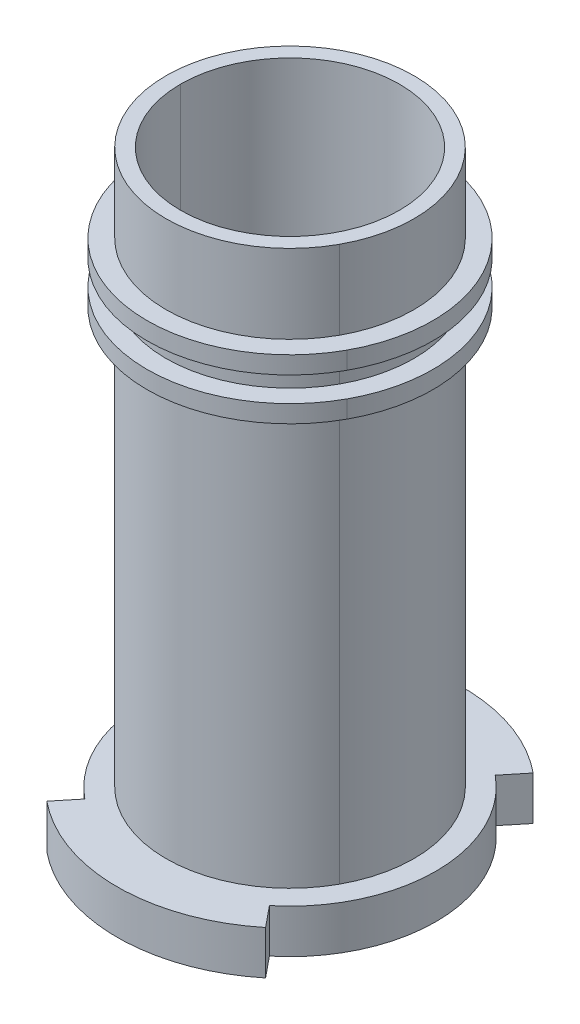
ISO-10303-21;
HEADER;
FILE_DESCRIPTION(('STEP AP214'),'2;1');
FILE_NAME('part.step','',(''),(''),'','','');
FILE_SCHEMA(('AUTOMOTIVE_DESIGN { 1 0 10303 214 1 1 1 1 }'));
ENDSEC;
DATA;
#1=APPLICATION_CONTEXT('core data for automotive mechanical design processes');
#2=APPLICATION_PROTOCOL_DEFINITION('international standard','automotive_design',2000,#1);
#3=PRODUCT_CONTEXT('',#1,'mechanical');
#4=PRODUCT('Part','Part','',(#3));
#5=PRODUCT_RELATED_PRODUCT_CATEGORY('part','',(#4));
#6=PRODUCT_DEFINITION_FORMATION('','',#4);
#7=PRODUCT_DEFINITION_CONTEXT('part definition',#1,'design');
#8=PRODUCT_DEFINITION('design','',#6,#7);
#9=PRODUCT_DEFINITION_SHAPE('','',#8);
#10=(LENGTH_UNIT() NAMED_UNIT(*) SI_UNIT(.MILLI.,.METRE.));
#11=(NAMED_UNIT(*) PLANE_ANGLE_UNIT() SI_UNIT($,.RADIAN.));
#12=(NAMED_UNIT(*) SI_UNIT($,.STERADIAN.) SOLID_ANGLE_UNIT());
#13=UNCERTAINTY_MEASURE_WITH_UNIT(LENGTH_MEASURE(1.E-05),#10,'distance_accuracy_value','');
#14=(GEOMETRIC_REPRESENTATION_CONTEXT(3) GLOBAL_UNCERTAINTY_ASSIGNED_CONTEXT((#13)) GLOBAL_UNIT_ASSIGNED_CONTEXT((#10,
#11,#12)) REPRESENTATION_CONTEXT('',''));
#15=CARTESIAN_POINT('',(0.,0.,0.));
#16=DIRECTION('',(0.,0.,1.));
#17=DIRECTION('',(1.,0.,0.));
#18=AXIS2_PLACEMENT_3D('',#15,#16,#17);
#19=CARTESIAN_POINT('',(8.5,0.,0.));
#20=DIRECTION('',(0.,-1.,0.));
#21=DIRECTION('',(0.,0.,-1.));
#22=AXIS2_PLACEMENT_3D('',#19,#20,#21);
#23=PLANE('',#22);
#24=CARTESIAN_POINT('',(0.,0.,0.));
#25=DIRECTION('',(0.,-1.,0.));
#26=DIRECTION('',(1.,0.,0.));
#27=AXIS2_PLACEMENT_3D('',#24,#25,#26);
#28=CIRCLE('',#27,7.5);
#29=CARTESIAN_POINT('',(7.5,0.,0.));
#30=VERTEX_POINT('',#29);
#31=CARTESIAN_POINT('',(-7.5,0.,0.));
#32=VERTEX_POINT('',#31);
#33=EDGE_CURVE('E295',#30,#32,#28,.T.);
#34=ORIENTED_EDGE('',*,*,#33,.F.);
#35=CARTESIAN_POINT('',(0.,0.,0.));
#36=DIRECTION('',(0.,-1.,0.));
#37=DIRECTION('',(1.,0.,0.));
#38=AXIS2_PLACEMENT_3D('',#35,#36,#37);
#39=CIRCLE('',#38,7.5);
#40=EDGE_CURVE('E11',#32,#30,#39,.T.);
#41=ORIENTED_EDGE('',*,*,#40,.F.);
#42=EDGE_LOOP('',(#34,#41));
#43=FACE_BOUND('',#42,.T.);
#44=CARTESIAN_POINT('',(0.,0.,0.));
#45=DIRECTION('',(0.,-1.,0.));
#46=DIRECTION('',(1.,0.,0.));
#47=AXIS2_PLACEMENT_3D('',#44,#45,#46);
#48=CIRCLE('',#47,8.);
#49=CARTESIAN_POINT('',(8.,0.,0.));
#50=VERTEX_POINT('',#49);
#51=CARTESIAN_POINT('',(-8.,0.,0.));
#52=VERTEX_POINT('',#51);
#53=EDGE_CURVE('E280',#50,#52,#48,.T.);
#54=ORIENTED_EDGE('',*,*,#53,.T.);
#55=CARTESIAN_POINT('',(0.,0.,0.));
#56=DIRECTION('',(0.,-1.,0.));
#57=DIRECTION('',(1.,0.,0.));
#58=AXIS2_PLACEMENT_3D('',#55,#56,#57);
#59=CIRCLE('',#58,8.);
#60=EDGE_CURVE('E299',#52,#50,#59,.T.);
#61=ORIENTED_EDGE('',*,*,#60,.T.);
#62=EDGE_LOOP('',(#54,#61));
#63=FACE_BOUND('',#62,.T.);
#64=ADVANCED_FACE('F16',(#43,#63),#23,.T.);
#65=CARTESIAN_POINT('',(0.,11.,0.));
#66=DIRECTION('',(0.,1.,0.));
#67=DIRECTION('',(-1.,0.,0.));
#68=AXIS2_PLACEMENT_3D('',#65,#66,#67);
#69=CYLINDRICAL_SURFACE('',#68,7.5);
#70=ORIENTED_EDGE('',*,*,#40,.T.);
#71=DIRECTION('',(0.,-1.,0.));
#72=VECTOR('',#71,1.);
#73=CARTESIAN_POINT('',(7.5,11.,0.));
#74=LINE('',#73,#72);
#75=CARTESIAN_POINT('',(7.5,38.,0.));
#76=VERTEX_POINT('',#75);
#77=EDGE_CURVE('E27',#76,#30,#74,.T.);
#78=ORIENTED_EDGE('',*,*,#77,.F.);
#79=CARTESIAN_POINT('',(0.,38.,0.));
#80=DIRECTION('',(0.,1.,0.));
#81=DIRECTION('',(1.,0.,0.));
#82=AXIS2_PLACEMENT_3D('',#79,#80,#81);
#83=CIRCLE('',#82,7.5);
#84=CARTESIAN_POINT('',(-7.5,38.,0.));
#85=VERTEX_POINT('',#84);
#86=EDGE_CURVE('E287',#76,#85,#83,.T.);
#87=ORIENTED_EDGE('',*,*,#86,.T.);
#88=DIRECTION('',(0.,-1.,0.));
#89=VECTOR('',#88,1.);
#90=CARTESIAN_POINT('',(-7.5,11.,0.));
#91=LINE('',#90,#89);
#92=EDGE_CURVE('E366',#85,#32,#91,.T.);
#93=ORIENTED_EDGE('',*,*,#92,.T.);
#94=EDGE_LOOP('',(#70,#78,#87,#93));
#95=FACE_BOUND('',#94,.T.);
#96=ADVANCED_FACE('F471',(#95),#69,.F.);
#97=CARTESIAN_POINT('',(0.,11.,0.));
#98=DIRECTION('',(0.,1.,0.));
#99=DIRECTION('',(-1.,0.,0.));
#100=AXIS2_PLACEMENT_3D('',#97,#98,#99);
#101=CYLINDRICAL_SURFACE('',#100,7.5);
#102=ORIENTED_EDGE('',*,*,#33,.T.);
#103=ORIENTED_EDGE('',*,*,#92,.F.);
#104=CARTESIAN_POINT('',(0.,38.,0.));
#105=DIRECTION('',(0.,1.,0.));
#106=DIRECTION('',(1.,0.,0.));
#107=AXIS2_PLACEMENT_3D('',#104,#105,#106);
#108=CIRCLE('',#107,7.5);
#109=EDGE_CURVE('E291',#85,#76,#108,.T.);
#110=ORIENTED_EDGE('',*,*,#109,.T.);
#111=ORIENTED_EDGE('',*,*,#77,.T.);
#112=EDGE_LOOP('',(#102,#103,#110,#111));
#113=FACE_BOUND('',#112,.T.);
#114=ADVANCED_FACE('F475',(#113),#101,.F.);
#115=CARTESIAN_POINT('',(0.,38.,0.));
#116=DIRECTION('',(0.,-1.,0.));
#117=DIRECTION('',(0.,0.,-1.));
#118=AXIS2_PLACEMENT_3D('',#115,#116,#117);
#119=PLANE('',#118);
#120=ORIENTED_EDGE('',*,*,#86,.F.);
#121=ORIENTED_EDGE('',*,*,#109,.F.);
#122=EDGE_LOOP('',(#120,#121));
#123=FACE_BOUND('',#122,.T.);
#124=CARTESIAN_POINT('',(0.,38.,0.));
#125=DIRECTION('',(0.,-1.,0.));
#126=DIRECTION('',(1.,0.,0.));
#127=AXIS2_PLACEMENT_3D('',#124,#125,#126);
#128=CIRCLE('',#127,8.5);
#129=CARTESIAN_POINT('',(7.45945177607,38.,4.07511707814));
#130=VERTEX_POINT('',#129);
#131=CARTESIAN_POINT('',(-7.45945177607,38.,-4.07511707814));
#132=VERTEX_POINT('',#131);
#133=EDGE_CURVE('E227',#130,#132,#128,.T.);
#134=ORIENTED_EDGE('',*,*,#133,.F.);
#135=CARTESIAN_POINT('',(0.,38.,0.));
#136=DIRECTION('',(0.,-1.,0.));
#137=DIRECTION('',(1.,0.,0.));
#138=AXIS2_PLACEMENT_3D('',#135,#136,#137);
#139=CIRCLE('',#138,8.5);
#140=EDGE_CURVE('E222',#132,#130,#139,.T.);
#141=ORIENTED_EDGE('',*,*,#140,.F.);
#142=EDGE_LOOP('',(#134,#141));
#143=FACE_BOUND('',#142,.T.);
#144=ADVANCED_FACE('F481',(#123,#143),#119,.F.);
#145=CARTESIAN_POINT('',(0.,19.,0.));
#146=DIRECTION('',(0.,-1.,0.));
#147=DIRECTION('',(0.877582561890373,0.,0.479425538604204));
#148=AXIS2_PLACEMENT_3D('',#145,#146,#147);
#149=CYLINDRICAL_SURFACE('',#148,8.5);
#150=CARTESIAN_POINT('',(0.,32.6,0.));
#151=DIRECTION('',(0.,-1.,0.));
#152=DIRECTION('',(1.,0.,0.));
#153=AXIS2_PLACEMENT_3D('',#150,#151,#152);
#154=CIRCLE('',#153,8.5);
#155=CARTESIAN_POINT('',(-7.45945177607,32.6,-4.07511707814));
#156=VERTEX_POINT('',#155);
#157=CARTESIAN_POINT('',(7.45945177607,32.6,4.07511707814));
#158=VERTEX_POINT('',#157);
#159=EDGE_CURVE('E221',#156,#158,#154,.T.);
#160=ORIENTED_EDGE('',*,*,#159,.F.);
#161=DIRECTION('',(0.,1.,0.));
#162=VECTOR('',#161,1.);
#163=CARTESIAN_POINT('',(-7.45945177607,19.,-4.07511707814));
#164=LINE('',#163,#162);
#165=EDGE_CURVE('E232',#156,#132,#164,.T.);
#166=ORIENTED_EDGE('',*,*,#165,.T.);
#167=ORIENTED_EDGE('',*,*,#140,.T.);
#168=DIRECTION('',(0.,1.,0.));
#169=VECTOR('',#168,1.);
#170=CARTESIAN_POINT('',(7.45945177607,19.,4.07511707814));
#171=LINE('',#170,#169);
#172=EDGE_CURVE('E216',#158,#130,#171,.T.);
#173=ORIENTED_EDGE('',*,*,#172,.F.);
#174=EDGE_LOOP('',(#160,#166,#167,#173));
#175=FACE_BOUND('',#174,.T.);
#176=ADVANCED_FACE('F218',(#175),#149,.T.);
#177=CARTESIAN_POINT('',(0.,19.,0.));
#178=DIRECTION('',(0.,-1.,0.));
#179=DIRECTION('',(0.877582561890373,0.,0.479425538604204));
#180=AXIS2_PLACEMENT_3D('',#177,#178,#179);
#181=CYLINDRICAL_SURFACE('',#180,8.5);
#182=CARTESIAN_POINT('',(0.,32.6,0.));
#183=DIRECTION('',(0.,-1.,0.));
#184=DIRECTION('',(1.,0.,0.));
#185=AXIS2_PLACEMENT_3D('',#182,#183,#184);
#186=CIRCLE('',#185,8.5);
#187=EDGE_CURVE('E228',#158,#156,#186,.T.);
#188=ORIENTED_EDGE('',*,*,#187,.F.);
#189=ORIENTED_EDGE('',*,*,#172,.T.);
#190=ORIENTED_EDGE('',*,*,#133,.T.);
#191=ORIENTED_EDGE('',*,*,#165,.F.);
#192=EDGE_LOOP('',(#188,#189,#190,#191));
#193=FACE_BOUND('',#192,.T.);
#194=ADVANCED_FACE('F231',(#193),#181,.T.);
#195=CARTESIAN_POINT('',(8.5,32.6,0.));
#196=DIRECTION('',(0.,-1.,0.));
#197=DIRECTION('',(0.,0.,-1.));
#198=AXIS2_PLACEMENT_3D('',#195,#196,#197);
#199=PLANE('',#198);
#200=ORIENTED_EDGE('',*,*,#159,.T.);
#201=ORIENTED_EDGE('',*,*,#187,.T.);
#202=EDGE_LOOP('',(#200,#201));
#203=FACE_BOUND('',#202,.T.);
#204=CARTESIAN_POINT('',(0.,32.6,0.));
#205=DIRECTION('',(0.,-1.,0.));
#206=DIRECTION('',(1.,0.,0.));
#207=AXIS2_PLACEMENT_3D('',#204,#205,#206);
#208=CIRCLE('',#207,9.8);
#209=CARTESIAN_POINT('',(8.60030910653,32.6,4.69837027832));
#210=VERTEX_POINT('',#209);
#211=CARTESIAN_POINT('',(-8.60030910653,32.6,-4.69837027832));
#212=VERTEX_POINT('',#211);
#213=EDGE_CURVE('E239',#210,#212,#208,.T.);
#214=ORIENTED_EDGE('',*,*,#213,.F.);
#215=CARTESIAN_POINT('',(0.,32.6,0.));
#216=DIRECTION('',(0.,-1.,0.));
#217=DIRECTION('',(1.,0.,0.));
#218=AXIS2_PLACEMENT_3D('',#215,#216,#217);
#219=CIRCLE('',#218,9.8);
#220=EDGE_CURVE('E258',#212,#210,#219,.T.);
#221=ORIENTED_EDGE('',*,*,#220,.F.);
#222=EDGE_LOOP('',(#214,#221));
#223=FACE_BOUND('',#222,.T.);
#224=ADVANCED_FACE('F236',(#203,#223),#199,.F.);
#225=CARTESIAN_POINT('',(0.,19.,0.));
#226=DIRECTION('',(0.,-1.,0.));
#227=DIRECTION('',(0.877582561890373,0.,0.479425538604204));
#228=AXIS2_PLACEMENT_3D('',#225,#226,#227);
#229=CYLINDRICAL_SURFACE('',#228,9.8);
#230=CARTESIAN_POINT('',(0.,31.4,0.));
#231=DIRECTION('',(0.,-1.,0.));
#232=DIRECTION('',(1.,0.,0.));
#233=AXIS2_PLACEMENT_3D('',#230,#231,#232);
#234=CIRCLE('',#233,9.8);
#235=CARTESIAN_POINT('',(8.60030910653,31.4,4.69837027832));
#236=VERTEX_POINT('',#235);
#237=CARTESIAN_POINT('',(-8.60030910653,31.4,-4.69837027832));
#238=VERTEX_POINT('',#237);
#239=EDGE_CURVE('E315',#236,#238,#234,.T.);
#240=ORIENTED_EDGE('',*,*,#239,.F.);
#241=DIRECTION('',(0.,1.,0.));
#242=VECTOR('',#241,1.);
#243=CARTESIAN_POINT('',(8.60030910653,30.55,4.69837027832));
#244=LINE('',#243,#242);
#245=EDGE_CURVE('E245',#236,#210,#244,.T.);
#246=ORIENTED_EDGE('',*,*,#245,.T.);
#247=ORIENTED_EDGE('',*,*,#213,.T.);
#248=DIRECTION('',(0.,1.,0.));
#249=VECTOR('',#248,1.);
#250=CARTESIAN_POINT('',(-8.60030910653,30.55,-4.69837027832));
#251=LINE('',#250,#249);
#252=EDGE_CURVE('E311',#238,#212,#251,.T.);
#253=ORIENTED_EDGE('',*,*,#252,.F.);
#254=EDGE_LOOP('',(#240,#246,#247,#253));
#255=FACE_BOUND('',#254,.T.);
#256=ADVANCED_FACE('F458',(#255),#229,.T.);
#257=CARTESIAN_POINT('',(0.,19.,0.));
#258=DIRECTION('',(0.,-1.,0.));
#259=DIRECTION('',(0.877582561890373,0.,0.479425538604204));
#260=AXIS2_PLACEMENT_3D('',#257,#258,#259);
#261=CYLINDRICAL_SURFACE('',#260,9.8);
#262=CARTESIAN_POINT('',(0.,31.4,0.));
#263=DIRECTION('',(0.,-1.,0.));
#264=DIRECTION('',(1.,0.,0.));
#265=AXIS2_PLACEMENT_3D('',#262,#263,#264);
#266=CIRCLE('',#265,9.8);
#267=EDGE_CURVE('E407',#238,#236,#266,.T.);
#268=ORIENTED_EDGE('',*,*,#267,.F.);
#269=ORIENTED_EDGE('',*,*,#252,.T.);
#270=ORIENTED_EDGE('',*,*,#220,.T.);
#271=ORIENTED_EDGE('',*,*,#245,.F.);
#272=EDGE_LOOP('',(#268,#269,#270,#271));
#273=FACE_BOUND('',#272,.T.);
#274=ADVANCED_FACE('F18',(#273),#261,.T.);
#275=CARTESIAN_POINT('',(9.8,31.4,0.));
#276=DIRECTION('',(0.,-1.,0.));
#277=DIRECTION('',(0.,0.,-1.));
#278=AXIS2_PLACEMENT_3D('',#275,#276,#277);
#279=PLANE('',#278);
#280=CARTESIAN_POINT('',(0.,31.4,0.));
#281=DIRECTION('',(0.,-1.,0.));
#282=DIRECTION('',(1.,0.,0.));
#283=AXIS2_PLACEMENT_3D('',#280,#281,#282);
#284=CIRCLE('',#283,8.5);
#285=CARTESIAN_POINT('',(7.45945177607,31.4,4.07511707814));
#286=VERTEX_POINT('',#285);
#287=CARTESIAN_POINT('',(-7.45945177607,31.4,-4.07511707814));
#288=VERTEX_POINT('',#287);
#289=EDGE_CURVE('E324',#286,#288,#284,.T.);
#290=ORIENTED_EDGE('',*,*,#289,.F.);
#291=CARTESIAN_POINT('',(0.,31.4,0.));
#292=DIRECTION('',(0.,-1.,0.));
#293=DIRECTION('',(1.,0.,0.));
#294=AXIS2_PLACEMENT_3D('',#291,#292,#293);
#295=CIRCLE('',#294,8.5);
#296=EDGE_CURVE('E323',#288,#286,#295,.T.);
#297=ORIENTED_EDGE('',*,*,#296,.F.);
#298=EDGE_LOOP('',(#290,#297));
#299=FACE_BOUND('',#298,.T.);
#300=ORIENTED_EDGE('',*,*,#267,.T.);
#301=ORIENTED_EDGE('',*,*,#239,.T.);
#302=EDGE_LOOP('',(#300,#301));
#303=FACE_BOUND('',#302,.T.);
#304=ADVANCED_FACE('F453',(#299,#303),#279,.T.);
#305=CARTESIAN_POINT('',(0.,19.,0.));
#306=DIRECTION('',(0.,-1.,0.));
#307=DIRECTION('',(0.877582561890373,0.,0.479425538604204));
#308=AXIS2_PLACEMENT_3D('',#305,#306,#307);
#309=CYLINDRICAL_SURFACE('',#308,8.5);
#310=CARTESIAN_POINT('',(0.,29.7,0.));
#311=DIRECTION('',(0.,-1.,0.));
#312=DIRECTION('',(1.,0.,0.));
#313=AXIS2_PLACEMENT_3D('',#310,#311,#312);
#314=CIRCLE('',#313,8.5);
#315=CARTESIAN_POINT('',(-7.45945177607,29.7,-4.07511707814));
#316=VERTEX_POINT('',#315);
#317=CARTESIAN_POINT('',(7.45945177607,29.7,4.07511707814));
#318=VERTEX_POINT('',#317);
#319=EDGE_CURVE('E281',#316,#318,#314,.T.);
#320=ORIENTED_EDGE('',*,*,#319,.F.);
#321=DIRECTION('',(0.,1.,0.));
#322=VECTOR('',#321,1.);
#323=CARTESIAN_POINT('',(-7.45945177607,19.,-4.07511707814));
#324=LINE('',#323,#322);
#325=EDGE_CURVE('E319',#316,#288,#324,.T.);
#326=ORIENTED_EDGE('',*,*,#325,.T.);
#327=ORIENTED_EDGE('',*,*,#296,.T.);
#328=DIRECTION('',(0.,1.,0.));
#329=VECTOR('',#328,1.);
#330=CARTESIAN_POINT('',(7.45945177607,19.,4.07511707814));
#331=LINE('',#330,#329);
#332=EDGE_CURVE('E337',#318,#286,#331,.T.);
#333=ORIENTED_EDGE('',*,*,#332,.F.);
#334=EDGE_LOOP('',(#320,#326,#327,#333));
#335=FACE_BOUND('',#334,.T.);
#336=ADVANCED_FACE('F548',(#335),#309,.T.);
#337=CARTESIAN_POINT('',(0.,19.,0.));
#338=DIRECTION('',(0.,-1.,0.));
#339=DIRECTION('',(0.877582561890373,0.,0.479425538604204));
#340=AXIS2_PLACEMENT_3D('',#337,#338,#339);
#341=CYLINDRICAL_SURFACE('',#340,8.5);
#342=CARTESIAN_POINT('',(0.,29.7,0.));
#343=DIRECTION('',(0.,-1.,0.));
#344=DIRECTION('',(1.,0.,0.));
#345=AXIS2_PLACEMENT_3D('',#342,#343,#344);
#346=CIRCLE('',#345,8.5);
#347=EDGE_CURVE('E285',#318,#316,#346,.T.);
#348=ORIENTED_EDGE('',*,*,#347,.F.);
#349=ORIENTED_EDGE('',*,*,#332,.T.);
#350=ORIENTED_EDGE('',*,*,#289,.T.);
#351=ORIENTED_EDGE('',*,*,#325,.F.);
#352=EDGE_LOOP('',(#348,#349,#350,#351));
#353=FACE_BOUND('',#352,.T.);
#354=ADVANCED_FACE('F550',(#353),#341,.T.);
#355=CARTESIAN_POINT('',(8.5,29.7,0.));
#356=DIRECTION('',(0.,-1.,0.));
#357=DIRECTION('',(0.,0.,-1.));
#358=AXIS2_PLACEMENT_3D('',#355,#356,#357);
#359=PLANE('',#358);
#360=ORIENTED_EDGE('',*,*,#319,.T.);
#361=ORIENTED_EDGE('',*,*,#347,.T.);
#362=EDGE_LOOP('',(#360,#361));
#363=FACE_BOUND('',#362,.T.);
#364=CARTESIAN_POINT('',(0.,29.7,0.));
#365=DIRECTION('',(0.,-1.,0.));
#366=DIRECTION('',(1.,0.,0.));
#367=AXIS2_PLACEMENT_3D('',#364,#365,#366);
#368=CIRCLE('',#367,9.8);
#369=CARTESIAN_POINT('',(8.60030910653,29.7,4.69837027832));
#370=VERTEX_POINT('',#369);
#371=CARTESIAN_POINT('',(-8.60030910653,29.7,-4.69837027832));
#372=VERTEX_POINT('',#371);
#373=EDGE_CURVE('E286',#370,#372,#368,.T.);
#374=ORIENTED_EDGE('',*,*,#373,.F.);
#375=CARTESIAN_POINT('',(0.,29.7,0.));
#376=DIRECTION('',(0.,-1.,0.));
#377=DIRECTION('',(1.,0.,0.));
#378=AXIS2_PLACEMENT_3D('',#375,#376,#377);
#379=CIRCLE('',#378,9.8);
#380=EDGE_CURVE('E400',#372,#370,#379,.T.);
#381=ORIENTED_EDGE('',*,*,#380,.F.);
#382=EDGE_LOOP('',(#374,#381));
#383=FACE_BOUND('',#382,.T.);
#384=ADVANCED_FACE('F540',(#363,#383),#359,.F.);
#385=CARTESIAN_POINT('',(0.,19.,0.));
#386=DIRECTION('',(0.,-1.,0.));
#387=DIRECTION('',(0.877582561890373,0.,0.479425538604204));
#388=AXIS2_PLACEMENT_3D('',#385,#386,#387);
#389=CYLINDRICAL_SURFACE('',#388,9.8);
#390=CARTESIAN_POINT('',(0.,28.5,0.));
#391=DIRECTION('',(0.,-1.,0.));
#392=DIRECTION('',(1.,0.,0.));
#393=AXIS2_PLACEMENT_3D('',#390,#391,#392);
#394=CIRCLE('',#393,9.8);
#395=CARTESIAN_POINT('',(8.60030910653,28.5,4.69837027832));
#396=VERTEX_POINT('',#395);
#397=CARTESIAN_POINT('',(-8.60030910653,28.5,-4.69837027832));
#398=VERTEX_POINT('',#397);
#399=EDGE_CURVE('E328',#396,#398,#394,.T.);
#400=ORIENTED_EDGE('',*,*,#399,.F.);
#401=DIRECTION('',(0.,1.,0.));
#402=VECTOR('',#401,1.);
#403=CARTESIAN_POINT('',(8.60030910653,30.55,4.69837027832));
#404=LINE('',#403,#402);
#405=EDGE_CURVE('E303',#396,#370,#404,.T.);
#406=ORIENTED_EDGE('',*,*,#405,.T.);
#407=ORIENTED_EDGE('',*,*,#373,.T.);
#408=DIRECTION('',(0.,1.,0.));
#409=VECTOR('',#408,1.);
#410=CARTESIAN_POINT('',(-8.60030910653,30.55,-4.69837027832));
#411=LINE('',#410,#409);
#412=EDGE_CURVE('E332',#398,#372,#411,.T.);
#413=ORIENTED_EDGE('',*,*,#412,.F.);
#414=EDGE_LOOP('',(#400,#406,#407,#413));
#415=FACE_BOUND('',#414,.T.);
#416=ADVANCED_FACE('F537',(#415),#389,.T.);
#417=CARTESIAN_POINT('',(0.,19.,0.));
#418=DIRECTION('',(0.,-1.,0.));
#419=DIRECTION('',(0.877582561890373,0.,0.479425538604204));
#420=AXIS2_PLACEMENT_3D('',#417,#418,#419);
#421=CYLINDRICAL_SURFACE('',#420,9.8);
#422=CARTESIAN_POINT('',(0.,28.5,0.));
#423=DIRECTION('',(0.,-1.,0.));
#424=DIRECTION('',(1.,0.,0.));
#425=AXIS2_PLACEMENT_3D('',#422,#423,#424);
#426=CIRCLE('',#425,9.8);
#427=EDGE_CURVE('E333',#398,#396,#426,.T.);
#428=ORIENTED_EDGE('',*,*,#427,.F.);
#429=ORIENTED_EDGE('',*,*,#412,.T.);
#430=ORIENTED_EDGE('',*,*,#380,.T.);
#431=ORIENTED_EDGE('',*,*,#405,.F.);
#432=EDGE_LOOP('',(#428,#429,#430,#431));
#433=FACE_BOUND('',#432,.T.);
#434=ADVANCED_FACE('F497',(#433),#421,.T.);
#435=CARTESIAN_POINT('',(9.8,28.5,0.));
#436=DIRECTION('',(0.,-1.,0.));
#437=DIRECTION('',(0.,0.,-1.));
#438=AXIS2_PLACEMENT_3D('',#435,#436,#437);
#439=PLANE('',#438);
#440=CARTESIAN_POINT('',(0.,28.5,0.));
#441=DIRECTION('',(0.,-1.,0.));
#442=DIRECTION('',(1.,0.,0.));
#443=AXIS2_PLACEMENT_3D('',#440,#441,#442);
#444=CIRCLE('',#443,8.5);
#445=CARTESIAN_POINT('',(7.45945177607,28.5,4.07511707814));
#446=VERTEX_POINT('',#445);
#447=CARTESIAN_POINT('',(-7.45945177607,28.5,-4.07511707814));
#448=VERTEX_POINT('',#447);
#449=EDGE_CURVE('E249',#446,#448,#444,.T.);
#450=ORIENTED_EDGE('',*,*,#449,.F.);
#451=CARTESIAN_POINT('',(0.,28.5,0.));
#452=DIRECTION('',(0.,-1.,0.));
#453=DIRECTION('',(1.,0.,0.));
#454=AXIS2_PLACEMENT_3D('',#451,#452,#453);
#455=CIRCLE('',#454,8.5);
#456=EDGE_CURVE('E264',#448,#446,#455,.T.);
#457=ORIENTED_EDGE('',*,*,#456,.F.);
#458=EDGE_LOOP('',(#450,#457));
#459=FACE_BOUND('',#458,.T.);
#460=ORIENTED_EDGE('',*,*,#427,.T.);
#461=ORIENTED_EDGE('',*,*,#399,.T.);
#462=EDGE_LOOP('',(#460,#461));
#463=FACE_BOUND('',#462,.T.);
#464=ADVANCED_FACE('F494',(#459,#463),#439,.T.);
#465=CARTESIAN_POINT('',(0.,19.,0.));
#466=DIRECTION('',(0.,-1.,0.));
#467=DIRECTION('',(0.877582561890373,0.,0.479425538604204));
#468=AXIS2_PLACEMENT_3D('',#465,#466,#467);
#469=CYLINDRICAL_SURFACE('',#468,8.5);
#470=CARTESIAN_POINT('',(0.,0.,0.));
#471=DIRECTION('',(0.,-1.,0.));
#472=DIRECTION('',(1.,0.,0.));
#473=AXIS2_PLACEMENT_3D('',#470,#471,#472);
#474=CIRCLE('',#473,8.5);
#475=CARTESIAN_POINT('',(-7.45945177607,0.,-4.07511707814));
#476=VERTEX_POINT('',#475);
#477=CARTESIAN_POINT('',(7.45945177607,0.,4.07511707814));
#478=VERTEX_POINT('',#477);
#479=EDGE_CURVE('E356',#476,#478,#474,.T.);
#480=ORIENTED_EDGE('',*,*,#479,.F.);
#481=DIRECTION('',(0.,1.,0.));
#482=VECTOR('',#481,1.);
#483=CARTESIAN_POINT('',(-7.45945177607,19.,-4.07511707814));
#484=LINE('',#483,#482);
#485=EDGE_CURVE('E260',#476,#448,#484,.T.);
#486=ORIENTED_EDGE('',*,*,#485,.T.);
#487=ORIENTED_EDGE('',*,*,#456,.T.);
#488=DIRECTION('',(0.,1.,0.));
#489=VECTOR('',#488,1.);
#490=CARTESIAN_POINT('',(7.45945177607,19.,4.07511707814));
#491=LINE('',#490,#489);
#492=EDGE_CURVE('E276',#478,#446,#491,.T.);
#493=ORIENTED_EDGE('',*,*,#492,.F.);
#494=EDGE_LOOP('',(#480,#486,#487,#493));
#495=FACE_BOUND('',#494,.T.);
#496=ADVANCED_FACE('F492',(#495),#469,.T.);
#497=CARTESIAN_POINT('',(0.,19.,0.));
#498=DIRECTION('',(0.,-1.,0.));
#499=DIRECTION('',(0.877582561890373,0.,0.479425538604204));
#500=AXIS2_PLACEMENT_3D('',#497,#498,#499);
#501=CYLINDRICAL_SURFACE('',#500,8.5);
#502=CARTESIAN_POINT('',(0.,0.,0.));
#503=DIRECTION('',(0.,-1.,0.));
#504=DIRECTION('',(1.,0.,0.));
#505=AXIS2_PLACEMENT_3D('',#502,#503,#504);
#506=CIRCLE('',#505,8.5);
#507=EDGE_CURVE('E360',#478,#476,#506,.T.);
#508=ORIENTED_EDGE('',*,*,#507,.F.);
#509=ORIENTED_EDGE('',*,*,#492,.T.);
#510=ORIENTED_EDGE('',*,*,#449,.T.);
#511=ORIENTED_EDGE('',*,*,#485,.F.);
#512=EDGE_LOOP('',(#508,#509,#510,#511));
#513=FACE_BOUND('',#512,.T.);
#514=ADVANCED_FACE('F488',(#513),#501,.T.);
#515=CARTESIAN_POINT('',(0.,-1.5,0.));
#516=DIRECTION('',(0.,-1.,0.));
#517=DIRECTION('',(1.,0.,0.));
#518=AXIS2_PLACEMENT_3D('',#515,#516,#517);
#519=CYLINDRICAL_SURFACE('',#518,8.);
#520=CARTESIAN_POINT('',(0.,-3.,0.));
#521=DIRECTION('',(0.,-1.,0.));
#522=DIRECTION('',(1.,0.,0.));
#523=AXIS2_PLACEMENT_3D('',#520,#521,#522);
#524=CIRCLE('',#523,8.);
#525=CARTESIAN_POINT('',(8.,-3.,0.));
#526=VERTEX_POINT('',#525);
#527=CARTESIAN_POINT('',(-8.,-3.,0.));
#528=VERTEX_POINT('',#527);
#529=EDGE_CURVE('E251',#526,#528,#524,.T.);
#530=ORIENTED_EDGE('',*,*,#529,.T.);
#531=DIRECTION('',(0.,-1.,0.));
#532=VECTOR('',#531,1.);
#533=CARTESIAN_POINT('',(-8.,-1.5,0.));
#534=LINE('',#533,#532);
#535=EDGE_CURVE('E296',#52,#528,#534,.T.);
#536=ORIENTED_EDGE('',*,*,#535,.F.);
#537=ORIENTED_EDGE('',*,*,#53,.F.);
#538=DIRECTION('',(0.,-1.,0.));
#539=VECTOR('',#538,1.);
#540=CARTESIAN_POINT('',(8.,-1.5,0.));
#541=LINE('',#540,#539);
#542=EDGE_CURVE('E346',#50,#526,#541,.T.);
#543=ORIENTED_EDGE('',*,*,#542,.T.);
#544=EDGE_LOOP('',(#530,#536,#537,#543));
#545=FACE_BOUND('',#544,.T.);
#546=ADVANCED_FACE('F491',(#545),#519,.F.);
#547=CARTESIAN_POINT('',(0.,-1.5,0.));
#548=DIRECTION('',(0.,-1.,0.));
#549=DIRECTION('',(1.,0.,0.));
#550=AXIS2_PLACEMENT_3D('',#547,#548,#549);
#551=CYLINDRICAL_SURFACE('',#550,8.);
#552=CARTESIAN_POINT('',(0.,-3.,0.));
#553=DIRECTION('',(0.,-1.,0.));
#554=DIRECTION('',(1.,0.,0.));
#555=AXIS2_PLACEMENT_3D('',#552,#553,#554);
#556=CIRCLE('',#555,8.);
#557=EDGE_CURVE('E255',#528,#526,#556,.T.);
#558=ORIENTED_EDGE('',*,*,#557,.T.);
#559=ORIENTED_EDGE('',*,*,#542,.F.);
#560=ORIENTED_EDGE('',*,*,#60,.F.);
#561=ORIENTED_EDGE('',*,*,#535,.T.);
#562=EDGE_LOOP('',(#558,#559,#560,#561));
#563=FACE_BOUND('',#562,.T.);
#564=ADVANCED_FACE('F501',(#563),#551,.F.);
#565=CARTESIAN_POINT('',(-6.32911392405,0.,-7.74224237133));
#566=DIRECTION('',(-0.774224237132918,0.,0.632911392404933));
#567=DIRECTION('',(0.,1.,0.));
#568=AXIS2_PLACEMENT_3D('',#565,#566,#567);
#569=PLANE('',#568);
#570=DIRECTION('',(0.,-1.,0.));
#571=VECTOR('',#570,1.);
#572=CARTESIAN_POINT('',(6.32911392405,-1.5,7.74224237133));
#573=LINE('',#572,#571);
#574=CARTESIAN_POINT('',(6.32911392405,0.,7.74224237133));
#575=VERTEX_POINT('',#574);
#576=CARTESIAN_POINT('',(6.32911392405,-3.,7.74224237133));
#577=VERTEX_POINT('',#576);
#578=EDGE_CURVE('E349',#575,#577,#573,.T.);
#579=ORIENTED_EDGE('',*,*,#578,.F.);
#580=DIRECTION('',(0.632911392404933,0.,0.774224237132918));
#581=VECTOR('',#580,1.);
#582=CARTESIAN_POINT('',(6.91455696203,0.,8.45839979068));
#583=LINE('',#582,#581);
#584=CARTESIAN_POINT('',(7.5,0.,9.17455721002));
#585=VERTEX_POINT('',#584);
#586=EDGE_CURVE('E381',#575,#585,#583,.T.);
#587=ORIENTED_EDGE('',*,*,#586,.T.);
#588=DIRECTION('',(0.,-1.,0.));
#589=VECTOR('',#588,1.);
#590=CARTESIAN_POINT('',(7.5,-1.5,9.17455721002));
#591=LINE('',#590,#589);
#592=CARTESIAN_POINT('',(7.5,-3.,9.17455721002));
#593=VERTEX_POINT('',#592);
#594=EDGE_CURVE('E254',#585,#593,#591,.T.);
#595=ORIENTED_EDGE('',*,*,#594,.T.);
#596=DIRECTION('',(0.632911392404933,0.,0.774224237132918));
#597=VECTOR('',#596,1.);
#598=CARTESIAN_POINT('',(6.91455696203,-3.,8.45839979068));
#599=LINE('',#598,#597);
#600=EDGE_CURVE('E270',#577,#593,#599,.T.);
#601=ORIENTED_EDGE('',*,*,#600,.F.);
#602=EDGE_LOOP('',(#579,#587,#595,#601));
#603=FACE_BOUND('',#602,.T.);
#604=ADVANCED_FACE('F487',(#603),#569,.F.);
#605=CARTESIAN_POINT('',(0.,-1.5,0.));
#606=DIRECTION('',(0.,-1.,0.));
#607=DIRECTION('',(0.632911392404933,0.,-0.774224237132918));
#608=AXIS2_PLACEMENT_3D('',#605,#606,#607);
#609=CYLINDRICAL_SURFACE('',#608,10.);
#610=DIRECTION('',(0.,-1.,0.));
#611=VECTOR('',#610,1.);
#612=CARTESIAN_POINT('',(6.32911392405,-1.5,-7.74224237133));
#613=LINE('',#612,#611);
#614=CARTESIAN_POINT('',(6.32911392405,0.,-7.74224237133));
#615=VERTEX_POINT('',#614);
#616=CARTESIAN_POINT('',(6.32911392405,-3.,-7.74224237133));
#617=VERTEX_POINT('',#616);
#618=EDGE_CURVE('E327',#615,#617,#613,.T.);
#619=ORIENTED_EDGE('',*,*,#618,.F.);
#620=CARTESIAN_POINT('',(0.,0.,0.));
#621=DIRECTION('',(0.,-1.,0.));
#622=DIRECTION('',(1.,0.,0.));
#623=AXIS2_PLACEMENT_3D('',#620,#621,#622);
#624=CIRCLE('',#623,10.);
#625=EDGE_CURVE('E371',#615,#575,#624,.T.);
#626=ORIENTED_EDGE('',*,*,#625,.T.);
#627=ORIENTED_EDGE('',*,*,#578,.T.);
#628=CARTESIAN_POINT('',(0.,-3.,0.));
#629=DIRECTION('',(0.,-1.,0.));
#630=DIRECTION('',(1.,0.,0.));
#631=AXIS2_PLACEMENT_3D('',#628,#629,#630);
#632=CIRCLE('',#631,10.);
#633=EDGE_CURVE('E275',#617,#577,#632,.T.);
#634=ORIENTED_EDGE('',*,*,#633,.F.);
#635=EDGE_LOOP('',(#619,#626,#627,#634));
#636=FACE_BOUND('',#635,.T.);
#637=ADVANCED_FACE('F483',(#636),#609,.T.);
#638=CARTESIAN_POINT('',(6.32911392405,0.,-7.74224237133));
#639=DIRECTION('',(-0.774224237132918,0.,-0.632911392404933));
#640=DIRECTION('',(-0.632911392404933,0.,0.774224237132918));
#641=AXIS2_PLACEMENT_3D('',#638,#639,#640);
#642=PLANE('',#641);
#643=DIRECTION('',(0.,-1.,0.));
#644=VECTOR('',#643,1.);
#645=CARTESIAN_POINT('',(7.5,-1.5,-9.17455721002));
#646=LINE('',#645,#644);
#647=CARTESIAN_POINT('',(7.5,0.,-9.17455721002));
#648=VERTEX_POINT('',#647);
#649=CARTESIAN_POINT('',(7.5,-3.,-9.17455721002));
#650=VERTEX_POINT('',#649);
#651=EDGE_CURVE('E79',#648,#650,#646,.T.);
#652=ORIENTED_EDGE('',*,*,#651,.F.);
#653=DIRECTION('',(-0.632911392404933,0.,0.774224237132918));
#654=VECTOR('',#653,1.);
#655=CARTESIAN_POINT('',(6.91455696203,0.,-8.45839979068));
#656=LINE('',#655,#654);
#657=EDGE_CURVE('E367',#648,#615,#656,.T.);
#658=ORIENTED_EDGE('',*,*,#657,.T.);
#659=ORIENTED_EDGE('',*,*,#618,.T.);
#660=DIRECTION('',(-0.632911392404933,0.,0.774224237132918));
#661=VECTOR('',#660,1.);
#662=CARTESIAN_POINT('',(6.91455696203,-3.,-8.45839979068));
#663=LINE('',#662,#661);
#664=EDGE_CURVE('E354',#650,#617,#663,.T.);
#665=ORIENTED_EDGE('',*,*,#664,.F.);
#666=EDGE_LOOP('',(#652,#658,#659,#665));
#667=FACE_BOUND('',#666,.T.);
#668=ADVANCED_FACE('F486',(#667),#642,.F.);
#669=CARTESIAN_POINT('',(0.,-1.5,0.));
#670=DIRECTION('',(0.,-1.,0.));
#671=DIRECTION('',(-0.632911392404933,0.,-0.774224237132918));
#672=AXIS2_PLACEMENT_3D('',#669,#670,#671);
#673=CYLINDRICAL_SURFACE('',#672,11.85);
#674=DIRECTION('',(0.,-1.,0.));
#675=VECTOR('',#674,1.);
#676=CARTESIAN_POINT('',(-7.5,-1.5,-9.17455721002));
#677=LINE('',#676,#675);
#678=CARTESIAN_POINT('',(-7.5,0.,-9.17455721002));
#679=VERTEX_POINT('',#678);
#680=CARTESIAN_POINT('',(-7.5,-3.,-9.17455721002));
#681=VERTEX_POINT('',#680);
#682=EDGE_CURVE('E422',#679,#681,#677,.T.);
#683=ORIENTED_EDGE('',*,*,#682,.F.);
#684=CARTESIAN_POINT('',(0.,0.,0.));
#685=DIRECTION('',(0.,-1.,0.));
#686=DIRECTION('',(1.,0.,0.));
#687=AXIS2_PLACEMENT_3D('',#684,#685,#686);
#688=CIRCLE('',#687,11.85);
#689=EDGE_CURVE('E370',#679,#648,#688,.T.);
#690=ORIENTED_EDGE('',*,*,#689,.T.);
#691=ORIENTED_EDGE('',*,*,#651,.T.);
#692=CARTESIAN_POINT('',(0.,-3.,0.));
#693=DIRECTION('',(0.,-1.,0.));
#694=DIRECTION('',(1.,0.,0.));
#695=AXIS2_PLACEMENT_3D('',#692,#693,#694);
#696=CIRCLE('',#695,11.85);
#697=EDGE_CURVE('E88',#681,#650,#696,.T.);
#698=ORIENTED_EDGE('',*,*,#697,.F.);
#699=EDGE_LOOP('',(#683,#690,#691,#698));
#700=FACE_BOUND('',#699,.T.);
#701=ADVANCED_FACE('F518',(#700),#673,.T.);
#702=CARTESIAN_POINT('',(0.,-1.5,0.));
#703=DIRECTION('',(0.,-1.,0.));
#704=DIRECTION('',(0.632911392404933,0.,0.774224237132918));
#705=AXIS2_PLACEMENT_3D('',#702,#703,#704);
#706=CYLINDRICAL_SURFACE('',#705,11.85);
#707=ORIENTED_EDGE('',*,*,#594,.F.);
#708=CARTESIAN_POINT('',(0.,0.,0.));
#709=DIRECTION('',(0.,-1.,0.));
#710=DIRECTION('',(1.,0.,0.));
#711=AXIS2_PLACEMENT_3D('',#708,#709,#710);
#712=CIRCLE('',#711,11.85);
#713=CARTESIAN_POINT('',(-7.5,0.,9.17455721002));
#714=VERTEX_POINT('',#713);
#715=EDGE_CURVE('E390',#585,#714,#712,.T.);
#716=ORIENTED_EDGE('',*,*,#715,.T.);
#717=DIRECTION('',(0.,-1.,0.));
#718=VECTOR('',#717,1.);
#719=CARTESIAN_POINT('',(-7.5,-1.5,9.17455721002));
#720=LINE('',#719,#718);
#721=CARTESIAN_POINT('',(-7.5,-3.,9.17455721002));
#722=VERTEX_POINT('',#721);
#723=EDGE_CURVE('E265',#714,#722,#720,.T.);
#724=ORIENTED_EDGE('',*,*,#723,.T.);
#725=CARTESIAN_POINT('',(0.,-3.,0.));
#726=DIRECTION('',(0.,-1.,0.));
#727=DIRECTION('',(1.,0.,0.));
#728=AXIS2_PLACEMENT_3D('',#725,#726,#727);
#729=CIRCLE('',#728,11.85);
#730=EDGE_CURVE('E274',#593,#722,#729,.T.);
#731=ORIENTED_EDGE('',*,*,#730,.F.);
#732=EDGE_LOOP('',(#707,#716,#724,#731));
#733=FACE_BOUND('',#732,.T.);
#734=ADVANCED_FACE('F516',(#733),#706,.T.);
#735=CARTESIAN_POINT('',(0.,-3.,0.));
#736=DIRECTION('',(0.,-1.,0.));
#737=DIRECTION('',(0.,0.,-1.));
#738=AXIS2_PLACEMENT_3D('',#735,#736,#737);
#739=PLANE('',#738);
#740=ORIENTED_EDGE('',*,*,#557,.F.);
#741=ORIENTED_EDGE('',*,*,#529,.F.);
#742=EDGE_LOOP('',(#740,#741));
#743=FACE_BOUND('',#742,.T.);
#744=CARTESIAN_POINT('',(0.,-3.,0.));
#745=DIRECTION('',(0.,-1.,0.));
#746=DIRECTION('',(1.,0.,0.));
#747=AXIS2_PLACEMENT_3D('',#744,#745,#746);
#748=CIRCLE('',#747,10.);
#749=CARTESIAN_POINT('',(-6.32911392405,-3.,7.74224237133));
#750=VERTEX_POINT('',#749);
#751=CARTESIAN_POINT('',(-6.32911392405,-3.,-7.74224237133));
#752=VERTEX_POINT('',#751);
#753=EDGE_CURVE('E269',#750,#752,#748,.T.);
#754=ORIENTED_EDGE('',*,*,#753,.T.);
#755=DIRECTION('',(-0.632911392404933,0.,-0.774224237132918));
#756=VECTOR('',#755,1.);
#757=CARTESIAN_POINT('',(-6.91455696203,-3.,-8.45839979068));
#758=LINE('',#757,#756);
#759=EDGE_CURVE('E355',#752,#681,#758,.T.);
#760=ORIENTED_EDGE('',*,*,#759,.T.);
#761=ORIENTED_EDGE('',*,*,#697,.T.);
#762=ORIENTED_EDGE('',*,*,#664,.T.);
#763=ORIENTED_EDGE('',*,*,#633,.T.);
#764=ORIENTED_EDGE('',*,*,#600,.T.);
#765=ORIENTED_EDGE('',*,*,#730,.T.);
#766=DIRECTION('',(0.632911392404933,0.,-0.774224237132918));
#767=VECTOR('',#766,1.);
#768=CARTESIAN_POINT('',(-6.91455696203,-3.,8.45839979068));
#769=LINE('',#768,#767);
#770=EDGE_CURVE('E433',#722,#750,#769,.T.);
#771=ORIENTED_EDGE('',*,*,#770,.T.);
#772=EDGE_LOOP('',(#754,#760,#761,#762,#763,#764,#765,#771));
#773=FACE_BOUND('',#772,.T.);
#774=ADVANCED_FACE('F512',(#743,#773),#739,.T.);
#775=CARTESIAN_POINT('',(-6.32911392405,0.,-7.74224237133));
#776=DIRECTION('',(-0.774224237132918,0.,0.632911392404933));
#777=DIRECTION('',(0.,1.,0.));
#778=AXIS2_PLACEMENT_3D('',#775,#776,#777);
#779=PLANE('',#778);
#780=DIRECTION('',(0.,-1.,0.));
#781=VECTOR('',#780,1.);
#782=CARTESIAN_POINT('',(-6.32911392405,-1.5,-7.74224237133));
#783=LINE('',#782,#781);
#784=CARTESIAN_POINT('',(-6.32911392405,0.,-7.74224237133));
#785=VERTEX_POINT('',#784);
#786=EDGE_CURVE('E338',#785,#752,#783,.T.);
#787=ORIENTED_EDGE('',*,*,#786,.F.);
#788=DIRECTION('',(-0.632911392404933,0.,-0.774224237132918));
#789=VECTOR('',#788,1.);
#790=CARTESIAN_POINT('',(-6.91455696203,0.,-8.45839979068));
#791=LINE('',#790,#789);
#792=EDGE_CURVE('E361',#785,#679,#791,.T.);
#793=ORIENTED_EDGE('',*,*,#792,.T.);
#794=ORIENTED_EDGE('',*,*,#682,.T.);
#795=ORIENTED_EDGE('',*,*,#759,.F.);
#796=EDGE_LOOP('',(#787,#793,#794,#795));
#797=FACE_BOUND('',#796,.T.);
#798=ADVANCED_FACE('F515',(#797),#779,.T.);
#799=CARTESIAN_POINT('',(8.5,0.,0.));
#800=DIRECTION('',(0.,-1.,0.));
#801=DIRECTION('',(0.,0.,-1.));
#802=AXIS2_PLACEMENT_3D('',#799,#800,#801);
#803=PLANE('',#802);
#804=ORIENTED_EDGE('',*,*,#479,.T.);
#805=ORIENTED_EDGE('',*,*,#507,.T.);
#806=EDGE_LOOP('',(#804,#805));
#807=FACE_BOUND('',#806,.T.);
#808=DIRECTION('',(0.632911392404933,0.,-0.774224237132918));
#809=VECTOR('',#808,1.);
#810=CARTESIAN_POINT('',(-6.91455696203,0.,8.45839979068));
#811=LINE('',#810,#809);
#812=CARTESIAN_POINT('',(-6.32911392405,0.,7.74224237133));
#813=VERTEX_POINT('',#812);
#814=EDGE_CURVE('E20',#714,#813,#811,.T.);
#815=ORIENTED_EDGE('',*,*,#814,.F.);
#816=ORIENTED_EDGE('',*,*,#715,.F.);
#817=ORIENTED_EDGE('',*,*,#586,.F.);
#818=ORIENTED_EDGE('',*,*,#625,.F.);
#819=ORIENTED_EDGE('',*,*,#657,.F.);
#820=ORIENTED_EDGE('',*,*,#689,.F.);
#821=ORIENTED_EDGE('',*,*,#792,.F.);
#822=CARTESIAN_POINT('',(0.,0.,0.));
#823=DIRECTION('',(0.,-1.,0.));
#824=DIRECTION('',(1.,0.,0.));
#825=AXIS2_PLACEMENT_3D('',#822,#823,#824);
#826=CIRCLE('',#825,10.);
#827=EDGE_CURVE('E342',#813,#785,#826,.T.);
#828=ORIENTED_EDGE('',*,*,#827,.F.);
#829=EDGE_LOOP('',(#815,#816,#817,#818,#819,#820,#821,#828));
#830=FACE_BOUND('',#829,.T.);
#831=ADVANCED_FACE('F507',(#807,#830),#803,.F.);
#832=CARTESIAN_POINT('',(6.32911392405,0.,-7.74224237133));
#833=DIRECTION('',(-0.774224237132918,0.,-0.632911392404933));
#834=DIRECTION('',(-0.632911392404933,0.,0.774224237132918));
#835=AXIS2_PLACEMENT_3D('',#832,#833,#834);
#836=PLANE('',#835);
#837=ORIENTED_EDGE('',*,*,#723,.F.);
#838=ORIENTED_EDGE('',*,*,#814,.T.);
#839=DIRECTION('',(0.,-1.,0.));
#840=VECTOR('',#839,1.);
#841=CARTESIAN_POINT('',(-6.32911392405,-1.5,7.74224237133));
#842=LINE('',#841,#840);
#843=EDGE_CURVE('E429',#813,#750,#842,.T.);
#844=ORIENTED_EDGE('',*,*,#843,.T.);
#845=ORIENTED_EDGE('',*,*,#770,.F.);
#846=EDGE_LOOP('',(#837,#838,#844,#845));
#847=FACE_BOUND('',#846,.T.);
#848=ADVANCED_FACE('F503',(#847),#836,.T.);
#849=CARTESIAN_POINT('',(0.,-1.5,0.));
#850=DIRECTION('',(0.,-1.,0.));
#851=DIRECTION('',(-0.632911392404933,0.,0.774224237132918));
#852=AXIS2_PLACEMENT_3D('',#849,#850,#851);
#853=CYLINDRICAL_SURFACE('',#852,10.);
#854=ORIENTED_EDGE('',*,*,#843,.F.);
#855=ORIENTED_EDGE('',*,*,#827,.T.);
#856=ORIENTED_EDGE('',*,*,#786,.T.);
#857=ORIENTED_EDGE('',*,*,#753,.F.);
#858=EDGE_LOOP('',(#854,#855,#856,#857));
#859=FACE_BOUND('',#858,.T.);
#860=ADVANCED_FACE('F506',(#859),#853,.T.);
#861=CLOSED_SHELL('',(#64,#96,#114,#144,#176,#194,#224,#256,#274,#304,#336,#354,#384,#416,#434,
#464,#496,#514,#546,#564,#604,#637,#668,#701,#734,#774,#798,#831,#848,#860));
#862=MANIFOLD_SOLID_BREP('B1',#861);
#863=ADVANCED_BREP_SHAPE_REPRESENTATION('',(#18,#862),#14);
#864=SHAPE_DEFINITION_REPRESENTATION(#9,#863);
ENDSEC;
END-ISO-10303-21;
